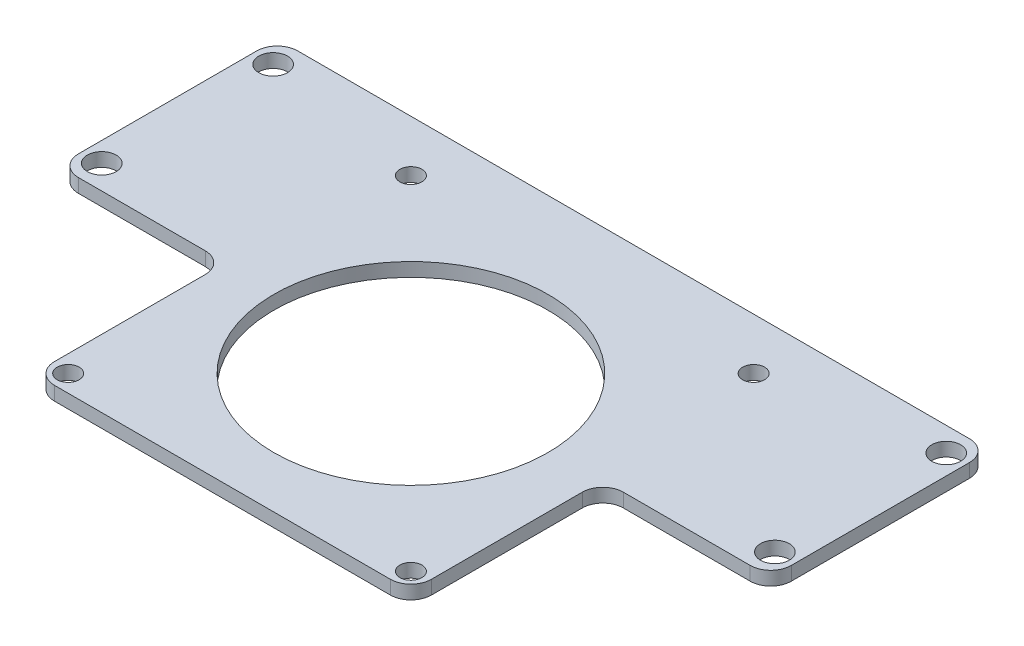
ISO-10303-21;
HEADER;
FILE_DESCRIPTION(('STEP AP214'),'2;1');
FILE_NAME('part.step','',(''),(''),'','','');
FILE_SCHEMA(('AUTOMOTIVE_DESIGN { 1 0 10303 214 1 1 1 1 }'));
ENDSEC;
DATA;
#1=APPLICATION_CONTEXT('core data for automotive mechanical design processes');
#2=APPLICATION_PROTOCOL_DEFINITION('international standard','automotive_design',2000,#1);
#3=PRODUCT_CONTEXT('',#1,'mechanical');
#4=PRODUCT('Part','Part','',(#3));
#5=PRODUCT_RELATED_PRODUCT_CATEGORY('part','',(#4));
#6=PRODUCT_DEFINITION_FORMATION('','',#4);
#7=PRODUCT_DEFINITION_CONTEXT('part definition',#1,'design');
#8=PRODUCT_DEFINITION('design','',#6,#7);
#9=PRODUCT_DEFINITION_SHAPE('','',#8);
#10=(LENGTH_UNIT() NAMED_UNIT(*) SI_UNIT(.MILLI.,.METRE.));
#11=(NAMED_UNIT(*) PLANE_ANGLE_UNIT() SI_UNIT($,.RADIAN.));
#12=(NAMED_UNIT(*) SI_UNIT($,.STERADIAN.) SOLID_ANGLE_UNIT());
#13=UNCERTAINTY_MEASURE_WITH_UNIT(LENGTH_MEASURE(1.E-05),#10,'distance_accuracy_value','');
#14=(GEOMETRIC_REPRESENTATION_CONTEXT(3) GLOBAL_UNCERTAINTY_ASSIGNED_CONTEXT((#13)) GLOBAL_UNIT_ASSIGNED_CONTEXT((#10,
#11,#12)) REPRESENTATION_CONTEXT('',''));
#15=CARTESIAN_POINT('',(0.,0.,0.));
#16=DIRECTION('',(0.,0.,1.));
#17=DIRECTION('',(1.,0.,0.));
#18=AXIS2_PLACEMENT_3D('',#15,#16,#17);
#19=CARTESIAN_POINT('',(27.5,2.,0.));
#20=DIRECTION('',(-1.,0.,0.));
#21=DIRECTION('',(0.,0.,1.));
#22=AXIS2_PLACEMENT_3D('',#19,#20,#21);
#23=PLANE('',#22);
#24=DIRECTION('',(0.,0.,-1.));
#25=VECTOR('',#24,1.);
#26=CARTESIAN_POINT('',(27.5,0.,0.));
#27=LINE('',#26,#25);
#28=CARTESIAN_POINT('',(27.5,0.,41.));
#29=VERTEX_POINT('',#28);
#30=CARTESIAN_POINT('',(27.5,0.,19.));
#31=VERTEX_POINT('',#30);
#32=EDGE_CURVE('E300',#29,#31,#27,.T.);
#33=ORIENTED_EDGE('',*,*,#32,.T.);
#34=DIRECTION('',(0.,-1.,0.));
#35=VECTOR('',#34,1.);
#36=CARTESIAN_POINT('',(27.5,2.,19.));
#37=LINE('',#36,#35);
#38=CARTESIAN_POINT('',(27.5,2.,19.));
#39=VERTEX_POINT('',#38);
#40=EDGE_CURVE('E218',#31,#39,#37,.F.);
#41=ORIENTED_EDGE('',*,*,#40,.T.);
#42=DIRECTION('',(0.,0.,-1.));
#43=VECTOR('',#42,1.);
#44=CARTESIAN_POINT('',(27.5,2.,0.));
#45=LINE('',#44,#43);
#46=CARTESIAN_POINT('',(27.5,2.,41.));
#47=VERTEX_POINT('',#46);
#48=EDGE_CURVE('E335',#47,#39,#45,.T.);
#49=ORIENTED_EDGE('',*,*,#48,.F.);
#50=DIRECTION('',(0.,-1.,0.));
#51=VECTOR('',#50,1.);
#52=CARTESIAN_POINT('',(27.5,2.,41.));
#53=LINE('',#52,#51);
#54=EDGE_CURVE('E215',#47,#29,#53,.T.);
#55=ORIENTED_EDGE('',*,*,#54,.T.);
#56=EDGE_LOOP('',(#33,#41,#49,#55));
#57=FACE_BOUND('',#56,.T.);
#58=ADVANCED_FACE('F37',(#57),#23,.F.);
#59=CARTESIAN_POINT('',(0.,2.,16.));
#60=DIRECTION('',(0.,0.,-1.));
#61=DIRECTION('',(-1.,0.,0.));
#62=AXIS2_PLACEMENT_3D('',#59,#60,#61);
#63=PLANE('',#62);
#64=DIRECTION('',(1.,0.,0.));
#65=VECTOR('',#64,1.);
#66=CARTESIAN_POINT('',(0.,0.,16.));
#67=LINE('',#66,#65);
#68=CARTESIAN_POINT('',(30.5,0.,16.));
#69=VERTEX_POINT('',#68);
#70=CARTESIAN_POINT('',(49.,0.,16.));
#71=VERTEX_POINT('',#70);
#72=EDGE_CURVE('E256',#69,#71,#67,.T.);
#73=ORIENTED_EDGE('',*,*,#72,.T.);
#74=DIRECTION('',(0.,-1.,0.));
#75=VECTOR('',#74,1.);
#76=CARTESIAN_POINT('',(49.,2.,16.));
#77=LINE('',#76,#75);
#78=CARTESIAN_POINT('',(49.,2.,16.));
#79=VERTEX_POINT('',#78);
#80=EDGE_CURVE('E213',#71,#79,#77,.F.);
#81=ORIENTED_EDGE('',*,*,#80,.T.);
#82=DIRECTION('',(1.,0.,0.));
#83=VECTOR('',#82,1.);
#84=CARTESIAN_POINT('',(0.,2.,16.));
#85=LINE('',#84,#83);
#86=CARTESIAN_POINT('',(30.5,2.,16.));
#87=VERTEX_POINT('',#86);
#88=EDGE_CURVE('E274',#87,#79,#85,.T.);
#89=ORIENTED_EDGE('',*,*,#88,.F.);
#90=DIRECTION('',(0.,-1.,0.));
#91=VECTOR('',#90,1.);
#92=CARTESIAN_POINT('',(30.5,0.,16.));
#93=LINE('',#92,#91);
#94=EDGE_CURVE('E210',#87,#69,#93,.T.);
#95=ORIENTED_EDGE('',*,*,#94,.T.);
#96=EDGE_LOOP('',(#73,#81,#89,#95));
#97=FACE_BOUND('',#96,.T.);
#98=ADVANCED_FACE('F362',(#97),#63,.F.);
#99=CARTESIAN_POINT('',(52.,2.,0.));
#100=DIRECTION('',(1.,0.,0.));
#101=DIRECTION('',(0.,0.,-1.));
#102=AXIS2_PLACEMENT_3D('',#99,#100,#101);
#103=PLANE('',#102);
#104=DIRECTION('',(0.,0.,1.));
#105=VECTOR('',#104,1.);
#106=CARTESIAN_POINT('',(52.,0.,0.));
#107=LINE('',#106,#105);
#108=CARTESIAN_POINT('',(52.,0.,-13.));
#109=VERTEX_POINT('',#108);
#110=CARTESIAN_POINT('',(52.,0.,13.));
#111=VERTEX_POINT('',#110);
#112=EDGE_CURVE('E172',#109,#111,#107,.T.);
#113=ORIENTED_EDGE('',*,*,#112,.F.);
#114=DIRECTION('',(0.,-1.,0.));
#115=VECTOR('',#114,1.);
#116=CARTESIAN_POINT('',(52.,2.,-13.));
#117=LINE('',#116,#115);
#118=CARTESIAN_POINT('',(52.,2.,-13.));
#119=VERTEX_POINT('',#118);
#120=EDGE_CURVE('E198',#109,#119,#117,.F.);
#121=ORIENTED_EDGE('',*,*,#120,.T.);
#122=DIRECTION('',(0.,0.,1.));
#123=VECTOR('',#122,1.);
#124=CARTESIAN_POINT('',(52.,2.,0.));
#125=LINE('',#124,#123);
#126=CARTESIAN_POINT('',(52.,2.,13.));
#127=VERTEX_POINT('',#126);
#128=EDGE_CURVE('E343',#119,#127,#125,.T.);
#129=ORIENTED_EDGE('',*,*,#128,.T.);
#130=DIRECTION('',(0.,-1.,0.));
#131=VECTOR('',#130,1.);
#132=CARTESIAN_POINT('',(52.,0.,13.));
#133=LINE('',#132,#131);
#134=EDGE_CURVE('E195',#127,#111,#133,.T.);
#135=ORIENTED_EDGE('',*,*,#134,.T.);
#136=EDGE_LOOP('',(#113,#121,#129,#135));
#137=FACE_BOUND('',#136,.T.);
#138=ADVANCED_FACE('F363',(#137),#103,.T.);
#139=CARTESIAN_POINT('',(0.,2.,-16.));
#140=DIRECTION('',(0.,0.,-1.));
#141=DIRECTION('',(-1.,0.,0.));
#142=AXIS2_PLACEMENT_3D('',#139,#140,#141);
#143=PLANE('',#142);
#144=DIRECTION('',(1.,0.,0.));
#145=VECTOR('',#144,1.);
#146=CARTESIAN_POINT('',(0.,2.,-16.));
#147=LINE('',#146,#145);
#148=CARTESIAN_POINT('',(-49.,2.,-16.));
#149=VERTEX_POINT('',#148);
#150=CARTESIAN_POINT('',(49.,2.,-16.));
#151=VERTEX_POINT('',#150);
#152=EDGE_CURVE('E346',#149,#151,#147,.T.);
#153=ORIENTED_EDGE('',*,*,#152,.T.);
#154=DIRECTION('',(0.,-1.,0.));
#155=VECTOR('',#154,1.);
#156=CARTESIAN_POINT('',(49.,2.,-16.));
#157=LINE('',#156,#155);
#158=CARTESIAN_POINT('',(49.,0.,-16.));
#159=VERTEX_POINT('',#158);
#160=EDGE_CURVE('E163',#151,#159,#157,.T.);
#161=ORIENTED_EDGE('',*,*,#160,.T.);
#162=DIRECTION('',(1.,0.,0.));
#163=VECTOR('',#162,1.);
#164=CARTESIAN_POINT('',(0.,0.,-16.));
#165=LINE('',#164,#163);
#166=CARTESIAN_POINT('',(-49.,0.,-16.));
#167=VERTEX_POINT('',#166);
#168=EDGE_CURVE('E155',#167,#159,#165,.T.);
#169=ORIENTED_EDGE('',*,*,#168,.F.);
#170=DIRECTION('',(0.,-1.,0.));
#171=VECTOR('',#170,1.);
#172=CARTESIAN_POINT('',(-49.,2.,-16.));
#173=LINE('',#172,#171);
#174=EDGE_CURVE('E169',#167,#149,#173,.F.);
#175=ORIENTED_EDGE('',*,*,#174,.T.);
#176=EDGE_LOOP('',(#153,#161,#169,#175));
#177=FACE_BOUND('',#176,.T.);
#178=ADVANCED_FACE('F168',(#177),#143,.T.);
#179=CARTESIAN_POINT('',(-52.,2.,0.));
#180=DIRECTION('',(1.,0.,0.));
#181=DIRECTION('',(0.,0.,-1.));
#182=AXIS2_PLACEMENT_3D('',#179,#180,#181);
#183=PLANE('',#182);
#184=DIRECTION('',(0.,0.,1.));
#185=VECTOR('',#184,1.);
#186=CARTESIAN_POINT('',(-52.,0.,0.));
#187=LINE('',#186,#185);
#188=CARTESIAN_POINT('',(-52.,0.,-13.));
#189=VERTEX_POINT('',#188);
#190=CARTESIAN_POINT('',(-52.,0.,13.));
#191=VERTEX_POINT('',#190);
#192=EDGE_CURVE('E157',#189,#191,#187,.T.);
#193=ORIENTED_EDGE('',*,*,#192,.T.);
#194=DIRECTION('',(0.,-1.,0.));
#195=VECTOR('',#194,1.);
#196=CARTESIAN_POINT('',(-52.,2.,13.));
#197=LINE('',#196,#195);
#198=CARTESIAN_POINT('',(-52.,2.,13.));
#199=VERTEX_POINT('',#198);
#200=EDGE_CURVE('E236',#191,#199,#197,.F.);
#201=ORIENTED_EDGE('',*,*,#200,.T.);
#202=DIRECTION('',(0.,0.,1.));
#203=VECTOR('',#202,1.);
#204=CARTESIAN_POINT('',(-52.,2.,0.));
#205=LINE('',#204,#203);
#206=CARTESIAN_POINT('',(-52.,2.,-13.));
#207=VERTEX_POINT('',#206);
#208=EDGE_CURVE('E272',#207,#199,#205,.T.);
#209=ORIENTED_EDGE('',*,*,#208,.F.);
#210=DIRECTION('',(0.,-1.,0.));
#211=VECTOR('',#210,1.);
#212=CARTESIAN_POINT('',(-52.,0.,-13.));
#213=LINE('',#212,#211);
#214=EDGE_CURVE('E234',#207,#189,#213,.T.);
#215=ORIENTED_EDGE('',*,*,#214,.T.);
#216=EDGE_LOOP('',(#193,#201,#209,#215));
#217=FACE_BOUND('',#216,.T.);
#218=ADVANCED_FACE('F354',(#217),#183,.F.);
#219=CARTESIAN_POINT('',(-49.,0.,16.));
#220=VERTEX_POINT('',#219);
#221=CARTESIAN_POINT('',(-30.5,0.,16.));
#222=VERTEX_POINT('',#221);
#223=EDGE_CURVE('E244',#220,#222,#67,.T.);
#224=ORIENTED_EDGE('',*,*,#223,.T.);
#225=DIRECTION('',(0.,-1.,0.));
#226=VECTOR('',#225,1.);
#227=CARTESIAN_POINT('',(-30.5,2.,16.));
#228=LINE('',#227,#226);
#229=CARTESIAN_POINT('',(-30.5,2.,16.));
#230=VERTEX_POINT('',#229);
#231=EDGE_CURVE('E232',#222,#230,#228,.F.);
#232=ORIENTED_EDGE('',*,*,#231,.T.);
#233=CARTESIAN_POINT('',(-49.,2.,16.));
#234=VERTEX_POINT('',#233);
#235=EDGE_CURVE('E264',#234,#230,#85,.T.);
#236=ORIENTED_EDGE('',*,*,#235,.F.);
#237=DIRECTION('',(0.,-1.,0.));
#238=VECTOR('',#237,1.);
#239=CARTESIAN_POINT('',(-49.,2.,16.));
#240=LINE('',#239,#238);
#241=EDGE_CURVE('E229',#234,#220,#240,.T.);
#242=ORIENTED_EDGE('',*,*,#241,.T.);
#243=EDGE_LOOP('',(#224,#232,#236,#242));
#244=FACE_BOUND('',#243,.T.);
#245=ADVANCED_FACE('F251',(#244),#63,.F.);
#246=CARTESIAN_POINT('',(-27.5,2.,0.));
#247=DIRECTION('',(-1.,0.,0.));
#248=DIRECTION('',(0.,0.,1.));
#249=AXIS2_PLACEMENT_3D('',#246,#247,#248);
#250=PLANE('',#249);
#251=DIRECTION('',(0.,0.,-1.));
#252=VECTOR('',#251,1.);
#253=CARTESIAN_POINT('',(-27.5,0.,0.));
#254=LINE('',#253,#252);
#255=CARTESIAN_POINT('',(-27.5,0.,41.));
#256=VERTEX_POINT('',#255);
#257=CARTESIAN_POINT('',(-27.5,0.,19.));
#258=VERTEX_POINT('',#257);
#259=EDGE_CURVE('E246',#256,#258,#254,.T.);
#260=ORIENTED_EDGE('',*,*,#259,.F.);
#261=DIRECTION('',(0.,-1.,0.));
#262=VECTOR('',#261,1.);
#263=CARTESIAN_POINT('',(-27.5,2.,41.));
#264=LINE('',#263,#262);
#265=CARTESIAN_POINT('',(-27.5,2.,41.));
#266=VERTEX_POINT('',#265);
#267=EDGE_CURVE('E227',#256,#266,#264,.F.);
#268=ORIENTED_EDGE('',*,*,#267,.T.);
#269=DIRECTION('',(0.,0.,-1.));
#270=VECTOR('',#269,1.);
#271=CARTESIAN_POINT('',(-27.5,2.,0.));
#272=LINE('',#271,#270);
#273=CARTESIAN_POINT('',(-27.5,2.,19.));
#274=VERTEX_POINT('',#273);
#275=EDGE_CURVE('E263',#266,#274,#272,.T.);
#276=ORIENTED_EDGE('',*,*,#275,.T.);
#277=DIRECTION('',(0.,-1.,0.));
#278=VECTOR('',#277,1.);
#279=CARTESIAN_POINT('',(-27.5,2.,19.));
#280=LINE('',#279,#278);
#281=EDGE_CURVE('E224',#274,#258,#280,.T.);
#282=ORIENTED_EDGE('',*,*,#281,.T.);
#283=EDGE_LOOP('',(#260,#268,#276,#282));
#284=FACE_BOUND('',#283,.T.);
#285=ADVANCED_FACE('F266',(#284),#250,.T.);
#286=CARTESIAN_POINT('',(25.,2.,41.5));
#287=DIRECTION('',(0.,-1.,0.));
#288=DIRECTION('',(0.,0.,-1.));
#289=AXIS2_PLACEMENT_3D('',#286,#287,#288);
#290=CYLINDRICAL_SURFACE('',#289,1.6);
#291=CARTESIAN_POINT('',(25.,2.,41.5));
#292=DIRECTION('',(0.,1.,0.));
#293=DIRECTION('',(0.,0.,1.));
#294=AXIS2_PLACEMENT_3D('',#291,#292,#293);
#295=CIRCLE('',#294,1.6);
#296=CARTESIAN_POINT('',(25.,2.,43.1));
#297=VERTEX_POINT('',#296);
#298=EDGE_CURVE('E180',#297,#297,#295,.F.);
#299=ORIENTED_EDGE('',*,*,#298,.F.);
#300=EDGE_LOOP('',(#299));
#301=FACE_BOUND('',#300,.T.);
#302=CARTESIAN_POINT('',(25.,0.,41.5));
#303=DIRECTION('',(0.,1.,0.));
#304=DIRECTION('',(0.,0.,1.));
#305=AXIS2_PLACEMENT_3D('',#302,#303,#304);
#306=CIRCLE('',#305,1.6);
#307=CARTESIAN_POINT('',(25.,0.,43.1));
#308=VERTEX_POINT('',#307);
#309=EDGE_CURVE('E330',#308,#308,#306,.F.);
#310=ORIENTED_EDGE('',*,*,#309,.T.);
#311=EDGE_LOOP('',(#310));
#312=FACE_BOUND('',#311,.T.);
#313=ADVANCED_FACE('F483',(#301,#312),#290,.F.);
#314=CARTESIAN_POINT('',(49.1,2.,-12.5));
#315=DIRECTION('',(0.,-1.,0.));
#316=DIRECTION('',(0.,0.,-1.));
#317=AXIS2_PLACEMENT_3D('',#314,#315,#316);
#318=CYLINDRICAL_SURFACE('',#317,2.1);
#319=CARTESIAN_POINT('',(49.1,2.,-12.5));
#320=DIRECTION('',(0.,1.,0.));
#321=DIRECTION('',(0.,0.,1.));
#322=AXIS2_PLACEMENT_3D('',#319,#320,#321);
#323=CIRCLE('',#322,2.1);
#324=CARTESIAN_POINT('',(49.1,2.,-10.4));
#325=VERTEX_POINT('',#324);
#326=EDGE_CURVE('E295',#325,#325,#323,.F.);
#327=ORIENTED_EDGE('',*,*,#326,.F.);
#328=EDGE_LOOP('',(#327));
#329=FACE_BOUND('',#328,.T.);
#330=CARTESIAN_POINT('',(49.1,0.,-12.5));
#331=DIRECTION('',(0.,1.,0.));
#332=DIRECTION('',(0.,0.,1.));
#333=AXIS2_PLACEMENT_3D('',#330,#331,#332);
#334=CIRCLE('',#333,2.1);
#335=CARTESIAN_POINT('',(49.1,0.,-10.4));
#336=VERTEX_POINT('',#335);
#337=EDGE_CURVE('E328',#336,#336,#334,.F.);
#338=ORIENTED_EDGE('',*,*,#337,.T.);
#339=EDGE_LOOP('',(#338));
#340=FACE_BOUND('',#339,.T.);
#341=ADVANCED_FACE('F583',(#329,#340),#318,.F.);
#342=CARTESIAN_POINT('',(49.1,2.,12.5));
#343=DIRECTION('',(0.,-1.,0.));
#344=DIRECTION('',(0.,0.,-1.));
#345=AXIS2_PLACEMENT_3D('',#342,#343,#344);
#346=CYLINDRICAL_SURFACE('',#345,2.1);
#347=CARTESIAN_POINT('',(49.1,2.,12.5));
#348=DIRECTION('',(0.,1.,0.));
#349=DIRECTION('',(0.,0.,1.));
#350=AXIS2_PLACEMENT_3D('',#347,#348,#349);
#351=CIRCLE('',#350,2.1);
#352=CARTESIAN_POINT('',(49.1,2.,14.6));
#353=VERTEX_POINT('',#352);
#354=EDGE_CURVE('E292',#353,#353,#351,.F.);
#355=ORIENTED_EDGE('',*,*,#354,.F.);
#356=EDGE_LOOP('',(#355));
#357=FACE_BOUND('',#356,.T.);
#358=CARTESIAN_POINT('',(49.1,0.,12.5));
#359=DIRECTION('',(0.,1.,0.));
#360=DIRECTION('',(0.,0.,1.));
#361=AXIS2_PLACEMENT_3D('',#358,#359,#360);
#362=CIRCLE('',#361,2.1);
#363=CARTESIAN_POINT('',(49.1,0.,14.6));
#364=VERTEX_POINT('',#363);
#365=EDGE_CURVE('E325',#364,#364,#362,.F.);
#366=ORIENTED_EDGE('',*,*,#365,.T.);
#367=EDGE_LOOP('',(#366));
#368=FACE_BOUND('',#367,.T.);
#369=ADVANCED_FACE('F573',(#357,#368),#346,.F.);
#370=CARTESIAN_POINT('',(-25.,2.,-8.5));
#371=DIRECTION('',(0.,-1.,0.));
#372=DIRECTION('',(0.,0.,-1.));
#373=AXIS2_PLACEMENT_3D('',#370,#371,#372);
#374=CYLINDRICAL_SURFACE('',#373,1.6);
#375=CARTESIAN_POINT('',(-25.,2.,-8.5));
#376=DIRECTION('',(0.,1.,0.));
#377=DIRECTION('',(0.,0.,1.));
#378=AXIS2_PLACEMENT_3D('',#375,#376,#377);
#379=CIRCLE('',#378,1.6);
#380=CARTESIAN_POINT('',(-25.,2.,-6.9));
#381=VERTEX_POINT('',#380);
#382=EDGE_CURVE('E289',#381,#381,#379,.T.);
#383=ORIENTED_EDGE('',*,*,#382,.T.);
#384=EDGE_LOOP('',(#383));
#385=FACE_BOUND('',#384,.T.);
#386=CARTESIAN_POINT('',(-25.,0.,-8.5));
#387=DIRECTION('',(0.,1.,0.));
#388=DIRECTION('',(0.,0.,1.));
#389=AXIS2_PLACEMENT_3D('',#386,#387,#388);
#390=CIRCLE('',#389,1.6);
#391=CARTESIAN_POINT('',(-25.,0.,-6.9));
#392=VERTEX_POINT('',#391);
#393=EDGE_CURVE('E322',#392,#392,#390,.T.);
#394=ORIENTED_EDGE('',*,*,#393,.F.);
#395=EDGE_LOOP('',(#394));
#396=FACE_BOUND('',#395,.T.);
#397=ADVANCED_FACE('F563',(#385,#396),#374,.F.);
#398=CARTESIAN_POINT('',(-49.1,2.,12.5));
#399=DIRECTION('',(0.,-1.,0.));
#400=DIRECTION('',(0.,0.,-1.));
#401=AXIS2_PLACEMENT_3D('',#398,#399,#400);
#402=CYLINDRICAL_SURFACE('',#401,2.1);
#403=CARTESIAN_POINT('',(-49.1,2.,12.5));
#404=DIRECTION('',(0.,1.,0.));
#405=DIRECTION('',(0.,0.,1.));
#406=AXIS2_PLACEMENT_3D('',#403,#404,#405);
#407=CIRCLE('',#406,2.1);
#408=CARTESIAN_POINT('',(-49.1,2.,14.6));
#409=VERTEX_POINT('',#408);
#410=EDGE_CURVE('E286',#409,#409,#407,.T.);
#411=ORIENTED_EDGE('',*,*,#410,.T.);
#412=EDGE_LOOP('',(#411));
#413=FACE_BOUND('',#412,.T.);
#414=CARTESIAN_POINT('',(-49.1,0.,12.5));
#415=DIRECTION('',(0.,1.,0.));
#416=DIRECTION('',(0.,0.,1.));
#417=AXIS2_PLACEMENT_3D('',#414,#415,#416);
#418=CIRCLE('',#417,2.1);
#419=CARTESIAN_POINT('',(-49.1,0.,14.6));
#420=VERTEX_POINT('',#419);
#421=EDGE_CURVE('E319',#420,#420,#418,.T.);
#422=ORIENTED_EDGE('',*,*,#421,.F.);
#423=EDGE_LOOP('',(#422));
#424=FACE_BOUND('',#423,.T.);
#425=ADVANCED_FACE('F553',(#413,#424),#402,.F.);
#426=CARTESIAN_POINT('',(-49.1,2.,-12.5));
#427=DIRECTION('',(0.,-1.,0.));
#428=DIRECTION('',(0.,0.,-1.));
#429=AXIS2_PLACEMENT_3D('',#426,#427,#428);
#430=CYLINDRICAL_SURFACE('',#429,2.1);
#431=CARTESIAN_POINT('',(-49.1,2.,-12.5));
#432=DIRECTION('',(0.,1.,0.));
#433=DIRECTION('',(0.,0.,1.));
#434=AXIS2_PLACEMENT_3D('',#431,#432,#433);
#435=CIRCLE('',#434,2.1);
#436=CARTESIAN_POINT('',(-49.1,2.,-10.4));
#437=VERTEX_POINT('',#436);
#438=EDGE_CURVE('E283',#437,#437,#435,.T.);
#439=ORIENTED_EDGE('',*,*,#438,.T.);
#440=EDGE_LOOP('',(#439));
#441=FACE_BOUND('',#440,.T.);
#442=CARTESIAN_POINT('',(-49.1,0.,-12.5));
#443=DIRECTION('',(0.,1.,0.));
#444=DIRECTION('',(0.,0.,1.));
#445=AXIS2_PLACEMENT_3D('',#442,#443,#444);
#446=CIRCLE('',#445,2.1);
#447=CARTESIAN_POINT('',(-49.1,0.,-10.4));
#448=VERTEX_POINT('',#447);
#449=EDGE_CURVE('E316',#448,#448,#446,.T.);
#450=ORIENTED_EDGE('',*,*,#449,.F.);
#451=EDGE_LOOP('',(#450));
#452=FACE_BOUND('',#451,.T.);
#453=ADVANCED_FACE('F543',(#441,#452),#430,.F.);
#454=CARTESIAN_POINT('',(25.,2.,-8.5));
#455=DIRECTION('',(0.,-1.,0.));
#456=DIRECTION('',(0.,0.,-1.));
#457=AXIS2_PLACEMENT_3D('',#454,#455,#456);
#458=CYLINDRICAL_SURFACE('',#457,1.60000000000001);
#459=CARTESIAN_POINT('',(25.,2.,-8.5));
#460=DIRECTION('',(0.,1.,0.));
#461=DIRECTION('',(0.,0.,1.));
#462=AXIS2_PLACEMENT_3D('',#459,#460,#461);
#463=CIRCLE('',#462,1.60000000000001);
#464=CARTESIAN_POINT('',(25.,2.,-6.89999999999999));
#465=VERTEX_POINT('',#464);
#466=EDGE_CURVE('E280',#465,#465,#463,.F.);
#467=ORIENTED_EDGE('',*,*,#466,.F.);
#468=EDGE_LOOP('',(#467));
#469=FACE_BOUND('',#468,.T.);
#470=CARTESIAN_POINT('',(25.,0.,-8.5));
#471=DIRECTION('',(0.,1.,0.));
#472=DIRECTION('',(0.,0.,1.));
#473=AXIS2_PLACEMENT_3D('',#470,#471,#472);
#474=CIRCLE('',#473,1.60000000000001);
#475=CARTESIAN_POINT('',(25.,0.,-6.89999999999999));
#476=VERTEX_POINT('',#475);
#477=EDGE_CURVE('E313',#476,#476,#474,.F.);
#478=ORIENTED_EDGE('',*,*,#477,.T.);
#479=EDGE_LOOP('',(#478));
#480=FACE_BOUND('',#479,.T.);
#481=ADVANCED_FACE('F533',(#469,#480),#458,.F.);
#482=CARTESIAN_POINT('',(0.,2.,16.5));
#483=DIRECTION('',(0.,-1.,0.));
#484=DIRECTION('',(0.,0.,-1.));
#485=AXIS2_PLACEMENT_3D('',#482,#483,#484);
#486=CYLINDRICAL_SURFACE('',#485,20.);
#487=CARTESIAN_POINT('',(0.,2.,16.5));
#488=DIRECTION('',(0.,1.,0.));
#489=DIRECTION('',(0.,0.,1.));
#490=AXIS2_PLACEMENT_3D('',#487,#488,#489);
#491=CIRCLE('',#490,20.);
#492=CARTESIAN_POINT('',(0.,2.,36.5));
#493=VERTEX_POINT('',#492);
#494=EDGE_CURVE('E270',#493,#493,#491,.T.);
#495=ORIENTED_EDGE('',*,*,#494,.T.);
#496=EDGE_LOOP('',(#495));
#497=FACE_BOUND('',#496,.T.);
#498=CARTESIAN_POINT('',(0.,0.,16.5));
#499=DIRECTION('',(0.,1.,0.));
#500=DIRECTION('',(0.,0.,1.));
#501=AXIS2_PLACEMENT_3D('',#498,#499,#500);
#502=CIRCLE('',#501,20.);
#503=CARTESIAN_POINT('',(0.,0.,36.5));
#504=VERTEX_POINT('',#503);
#505=EDGE_CURVE('E310',#504,#504,#502,.T.);
#506=ORIENTED_EDGE('',*,*,#505,.F.);
#507=EDGE_LOOP('',(#506));
#508=FACE_BOUND('',#507,.T.);
#509=ADVANCED_FACE('F471',(#497,#508),#486,.F.);
#510=CARTESIAN_POINT('',(0.,2.,44.));
#511=DIRECTION('',(0.,0.,-1.));
#512=DIRECTION('',(-1.,0.,0.));
#513=AXIS2_PLACEMENT_3D('',#510,#511,#512);
#514=PLANE('',#513);
#515=DIRECTION('',(1.,0.,0.));
#516=VECTOR('',#515,1.);
#517=CARTESIAN_POINT('',(0.,0.,44.));
#518=LINE('',#517,#516);
#519=CARTESIAN_POINT('',(-24.5,0.,44.));
#520=VERTEX_POINT('',#519);
#521=CARTESIAN_POINT('',(24.5,0.,44.));
#522=VERTEX_POINT('',#521);
#523=EDGE_CURVE('E308',#520,#522,#518,.T.);
#524=ORIENTED_EDGE('',*,*,#523,.T.);
#525=DIRECTION('',(0.,-1.,0.));
#526=VECTOR('',#525,1.);
#527=CARTESIAN_POINT('',(24.5,2.,44.));
#528=LINE('',#527,#526);
#529=CARTESIAN_POINT('',(24.5,2.,44.));
#530=VERTEX_POINT('',#529);
#531=EDGE_CURVE('E52',#522,#530,#528,.F.);
#532=ORIENTED_EDGE('',*,*,#531,.T.);
#533=DIRECTION('',(1.,0.,0.));
#534=VECTOR('',#533,1.);
#535=CARTESIAN_POINT('',(0.,2.,44.));
#536=LINE('',#535,#534);
#537=CARTESIAN_POINT('',(-24.5,2.,44.));
#538=VERTEX_POINT('',#537);
#539=EDGE_CURVE('E268',#538,#530,#536,.T.);
#540=ORIENTED_EDGE('',*,*,#539,.F.);
#541=DIRECTION('',(0.,-1.,0.));
#542=VECTOR('',#541,1.);
#543=CARTESIAN_POINT('',(-24.5,0.,44.));
#544=LINE('',#543,#542);
#545=EDGE_CURVE('E220',#538,#520,#544,.T.);
#546=ORIENTED_EDGE('',*,*,#545,.T.);
#547=EDGE_LOOP('',(#524,#532,#540,#546));
#548=FACE_BOUND('',#547,.T.);
#549=ADVANCED_FACE('F466',(#548),#514,.F.);
#550=CARTESIAN_POINT('',(-25.,2.,41.5));
#551=DIRECTION('',(0.,-1.,0.));
#552=DIRECTION('',(0.,0.,-1.));
#553=AXIS2_PLACEMENT_3D('',#550,#551,#552);
#554=CYLINDRICAL_SURFACE('',#553,1.6);
#555=CARTESIAN_POINT('',(-25.,2.,41.5));
#556=DIRECTION('',(0.,1.,0.));
#557=DIRECTION('',(0.,0.,1.));
#558=AXIS2_PLACEMENT_3D('',#555,#556,#557);
#559=CIRCLE('',#558,1.6);
#560=CARTESIAN_POINT('',(-25.,2.,43.1));
#561=VERTEX_POINT('',#560);
#562=EDGE_CURVE('E176',#561,#561,#559,.T.);
#563=ORIENTED_EDGE('',*,*,#562,.T.);
#564=EDGE_LOOP('',(#563));
#565=FACE_BOUND('',#564,.T.);
#566=CARTESIAN_POINT('',(-25.,0.,41.5));
#567=DIRECTION('',(0.,1.,0.));
#568=DIRECTION('',(0.,0.,1.));
#569=AXIS2_PLACEMENT_3D('',#566,#567,#568);
#570=CIRCLE('',#569,1.6);
#571=CARTESIAN_POINT('',(-25.,0.,43.1));
#572=VERTEX_POINT('',#571);
#573=EDGE_CURVE('E183',#572,#572,#570,.T.);
#574=ORIENTED_EDGE('',*,*,#573,.F.);
#575=EDGE_LOOP('',(#574));
#576=FACE_BOUND('',#575,.T.);
#577=ADVANCED_FACE('F459',(#565,#576),#554,.F.);
#578=CARTESIAN_POINT('',(0.,2.,0.));
#579=DIRECTION('',(0.,1.,0.));
#580=DIRECTION('',(0.,0.,1.));
#581=AXIS2_PLACEMENT_3D('',#578,#579,#580);
#582=PLANE('',#581);
#583=ORIENTED_EDGE('',*,*,#128,.F.);
#584=CARTESIAN_POINT('',(49.,2.,-13.));
#585=DIRECTION('',(0.,1.,0.));
#586=DIRECTION('',(0.,0.,1.));
#587=AXIS2_PLACEMENT_3D('',#584,#585,#586);
#588=CIRCLE('',#587,3.);
#589=EDGE_CURVE('E208',#119,#151,#588,.T.);
#590=ORIENTED_EDGE('',*,*,#589,.T.);
#591=ORIENTED_EDGE('',*,*,#152,.F.);
#592=CARTESIAN_POINT('',(-49.,2.,-13.));
#593=DIRECTION('',(0.,1.,0.));
#594=DIRECTION('',(0.,0.,1.));
#595=AXIS2_PLACEMENT_3D('',#592,#593,#594);
#596=CIRCLE('',#595,3.);
#597=EDGE_CURVE('E175',#149,#207,#596,.T.);
#598=ORIENTED_EDGE('',*,*,#597,.T.);
#599=ORIENTED_EDGE('',*,*,#208,.T.);
#600=CARTESIAN_POINT('',(-49.,2.,13.));
#601=DIRECTION('',(0.,1.,0.));
#602=DIRECTION('',(0.,0.,1.));
#603=AXIS2_PLACEMENT_3D('',#600,#601,#602);
#604=CIRCLE('',#603,3.);
#605=EDGE_CURVE('E201',#199,#234,#604,.T.);
#606=ORIENTED_EDGE('',*,*,#605,.T.);
#607=ORIENTED_EDGE('',*,*,#235,.T.);
#608=CARTESIAN_POINT('',(-30.5,2.,19.));
#609=DIRECTION('',(0.,1.,0.));
#610=DIRECTION('',(0.,0.,1.));
#611=AXIS2_PLACEMENT_3D('',#608,#609,#610);
#612=CIRCLE('',#611,3.);
#613=EDGE_CURVE('E11',#230,#274,#612,.F.);
#614=ORIENTED_EDGE('',*,*,#613,.T.);
#615=ORIENTED_EDGE('',*,*,#275,.F.);
#616=CARTESIAN_POINT('',(-24.5,2.,41.));
#617=DIRECTION('',(0.,1.,0.));
#618=DIRECTION('',(0.,0.,1.));
#619=AXIS2_PLACEMENT_3D('',#616,#617,#618);
#620=CIRCLE('',#619,3.);
#621=EDGE_CURVE('E59',#266,#538,#620,.T.);
#622=ORIENTED_EDGE('',*,*,#621,.T.);
#623=ORIENTED_EDGE('',*,*,#539,.T.);
#624=CARTESIAN_POINT('',(24.5,2.,41.));
#625=DIRECTION('',(0.,1.,0.));
#626=DIRECTION('',(0.,0.,1.));
#627=AXIS2_PLACEMENT_3D('',#624,#625,#626);
#628=CIRCLE('',#627,3.);
#629=EDGE_CURVE('E204',#530,#47,#628,.T.);
#630=ORIENTED_EDGE('',*,*,#629,.T.);
#631=ORIENTED_EDGE('',*,*,#48,.T.);
#632=CARTESIAN_POINT('',(30.5,2.,19.));
#633=DIRECTION('',(0.,1.,0.));
#634=DIRECTION('',(0.,0.,1.));
#635=AXIS2_PLACEMENT_3D('',#632,#633,#634);
#636=CIRCLE('',#635,3.);
#637=EDGE_CURVE('E240',#39,#87,#636,.F.);
#638=ORIENTED_EDGE('',*,*,#637,.T.);
#639=ORIENTED_EDGE('',*,*,#88,.T.);
#640=CARTESIAN_POINT('',(49.,2.,13.));
#641=DIRECTION('',(0.,1.,0.));
#642=DIRECTION('',(0.,0.,1.));
#643=AXIS2_PLACEMENT_3D('',#640,#641,#642);
#644=CIRCLE('',#643,3.);
#645=EDGE_CURVE('E206',#79,#127,#644,.T.);
#646=ORIENTED_EDGE('',*,*,#645,.T.);
#647=EDGE_LOOP('',(#583,#590,#591,#598,#599,#606,#607,#614,#615,#622,#623,#630,#631,#638,#639,#646));
#648=FACE_BOUND('',#647,.T.);
#649=ORIENTED_EDGE('',*,*,#494,.F.);
#650=EDGE_LOOP('',(#649));
#651=FACE_BOUND('',#650,.T.);
#652=ORIENTED_EDGE('',*,*,#466,.T.);
#653=EDGE_LOOP('',(#652));
#654=FACE_BOUND('',#653,.T.);
#655=ORIENTED_EDGE('',*,*,#438,.F.);
#656=EDGE_LOOP('',(#655));
#657=FACE_BOUND('',#656,.T.);
#658=ORIENTED_EDGE('',*,*,#410,.F.);
#659=EDGE_LOOP('',(#658));
#660=FACE_BOUND('',#659,.T.);
#661=ORIENTED_EDGE('',*,*,#382,.F.);
#662=EDGE_LOOP('',(#661));
#663=FACE_BOUND('',#662,.T.);
#664=ORIENTED_EDGE('',*,*,#354,.T.);
#665=EDGE_LOOP('',(#664));
#666=FACE_BOUND('',#665,.T.);
#667=ORIENTED_EDGE('',*,*,#326,.T.);
#668=EDGE_LOOP('',(#667));
#669=FACE_BOUND('',#668,.T.);
#670=ORIENTED_EDGE('',*,*,#298,.T.);
#671=EDGE_LOOP('',(#670));
#672=FACE_BOUND('',#671,.T.);
#673=ORIENTED_EDGE('',*,*,#562,.F.);
#674=EDGE_LOOP('',(#673));
#675=FACE_BOUND('',#674,.T.);
#676=ADVANCED_FACE('F261',(#648,#651,#654,#657,#660,#663,#666,#669,#672,#675),#582,.T.);
#677=CARTESIAN_POINT('',(0.,0.,0.));
#678=DIRECTION('',(0.,1.,0.));
#679=DIRECTION('',(0.,0.,1.));
#680=AXIS2_PLACEMENT_3D('',#677,#678,#679);
#681=PLANE('',#680);
#682=ORIENTED_EDGE('',*,*,#168,.T.);
#683=CARTESIAN_POINT('',(49.,0.,-13.));
#684=DIRECTION('',(0.,1.,0.));
#685=DIRECTION('',(0.,0.,1.));
#686=AXIS2_PLACEMENT_3D('',#683,#684,#685);
#687=CIRCLE('',#686,3.);
#688=EDGE_CURVE('E193',#159,#109,#687,.F.);
#689=ORIENTED_EDGE('',*,*,#688,.T.);
#690=ORIENTED_EDGE('',*,*,#112,.T.);
#691=CARTESIAN_POINT('',(49.,0.,13.));
#692=DIRECTION('',(0.,1.,0.));
#693=DIRECTION('',(0.,0.,1.));
#694=AXIS2_PLACEMENT_3D('',#691,#692,#693);
#695=CIRCLE('',#694,3.);
#696=EDGE_CURVE('E191',#111,#71,#695,.F.);
#697=ORIENTED_EDGE('',*,*,#696,.T.);
#698=ORIENTED_EDGE('',*,*,#72,.F.);
#699=CARTESIAN_POINT('',(30.5,0.,19.));
#700=DIRECTION('',(0.,1.,0.));
#701=DIRECTION('',(0.,0.,1.));
#702=AXIS2_PLACEMENT_3D('',#699,#700,#701);
#703=CIRCLE('',#702,3.);
#704=EDGE_CURVE('E238',#69,#31,#703,.T.);
#705=ORIENTED_EDGE('',*,*,#704,.T.);
#706=ORIENTED_EDGE('',*,*,#32,.F.);
#707=CARTESIAN_POINT('',(24.5,0.,41.));
#708=DIRECTION('',(0.,1.,0.));
#709=DIRECTION('',(0.,0.,1.));
#710=AXIS2_PLACEMENT_3D('',#707,#708,#709);
#711=CIRCLE('',#710,3.);
#712=EDGE_CURVE('E189',#29,#522,#711,.F.);
#713=ORIENTED_EDGE('',*,*,#712,.T.);
#714=ORIENTED_EDGE('',*,*,#523,.F.);
#715=CARTESIAN_POINT('',(-24.5,0.,41.));
#716=DIRECTION('',(0.,1.,0.));
#717=DIRECTION('',(0.,0.,1.));
#718=AXIS2_PLACEMENT_3D('',#715,#716,#717);
#719=CIRCLE('',#718,3.);
#720=EDGE_CURVE('E187',#520,#256,#719,.F.);
#721=ORIENTED_EDGE('',*,*,#720,.T.);
#722=ORIENTED_EDGE('',*,*,#259,.T.);
#723=CARTESIAN_POINT('',(-30.5,0.,19.));
#724=DIRECTION('',(0.,1.,0.));
#725=DIRECTION('',(0.,0.,1.));
#726=AXIS2_PLACEMENT_3D('',#723,#724,#725);
#727=CIRCLE('',#726,3.);
#728=EDGE_CURVE('E45',#258,#222,#727,.T.);
#729=ORIENTED_EDGE('',*,*,#728,.T.);
#730=ORIENTED_EDGE('',*,*,#223,.F.);
#731=CARTESIAN_POINT('',(-49.,0.,13.));
#732=DIRECTION('',(0.,1.,0.));
#733=DIRECTION('',(0.,0.,1.));
#734=AXIS2_PLACEMENT_3D('',#731,#732,#733);
#735=CIRCLE('',#734,3.);
#736=EDGE_CURVE('E162',#220,#191,#735,.F.);
#737=ORIENTED_EDGE('',*,*,#736,.T.);
#738=ORIENTED_EDGE('',*,*,#192,.F.);
#739=CARTESIAN_POINT('',(-49.,0.,-13.));
#740=DIRECTION('',(0.,1.,0.));
#741=DIRECTION('',(0.,0.,1.));
#742=AXIS2_PLACEMENT_3D('',#739,#740,#741);
#743=CIRCLE('',#742,3.);
#744=EDGE_CURVE('E151',#189,#167,#743,.F.);
#745=ORIENTED_EDGE('',*,*,#744,.T.);
#746=EDGE_LOOP('',(#682,#689,#690,#697,#698,#705,#706,#713,#714,#721,#722,#729,#730,#737,#738,#745));
#747=FACE_BOUND('',#746,.T.);
#748=ORIENTED_EDGE('',*,*,#505,.T.);
#749=EDGE_LOOP('',(#748));
#750=FACE_BOUND('',#749,.T.);
#751=ORIENTED_EDGE('',*,*,#477,.F.);
#752=EDGE_LOOP('',(#751));
#753=FACE_BOUND('',#752,.T.);
#754=ORIENTED_EDGE('',*,*,#449,.T.);
#755=EDGE_LOOP('',(#754));
#756=FACE_BOUND('',#755,.T.);
#757=ORIENTED_EDGE('',*,*,#421,.T.);
#758=EDGE_LOOP('',(#757));
#759=FACE_BOUND('',#758,.T.);
#760=ORIENTED_EDGE('',*,*,#393,.T.);
#761=EDGE_LOOP('',(#760));
#762=FACE_BOUND('',#761,.T.);
#763=ORIENTED_EDGE('',*,*,#365,.F.);
#764=EDGE_LOOP('',(#763));
#765=FACE_BOUND('',#764,.T.);
#766=ORIENTED_EDGE('',*,*,#337,.F.);
#767=EDGE_LOOP('',(#766));
#768=FACE_BOUND('',#767,.T.);
#769=ORIENTED_EDGE('',*,*,#309,.F.);
#770=EDGE_LOOP('',(#769));
#771=FACE_BOUND('',#770,.T.);
#772=ORIENTED_EDGE('',*,*,#573,.T.);
#773=EDGE_LOOP('',(#772));
#774=FACE_BOUND('',#773,.T.);
#775=ADVANCED_FACE('F153',(#747,#750,#753,#756,#759,#762,#765,#768,#771,#774),#681,.F.);
#776=CARTESIAN_POINT('',(49.,2.,-13.));
#777=DIRECTION('',(0.,-1.,0.));
#778=DIRECTION('',(0.,0.,-1.));
#779=AXIS2_PLACEMENT_3D('',#776,#777,#778);
#780=CYLINDRICAL_SURFACE('',#779,3.);
#781=ORIENTED_EDGE('',*,*,#589,.F.);
#782=ORIENTED_EDGE('',*,*,#120,.F.);
#783=ORIENTED_EDGE('',*,*,#688,.F.);
#784=ORIENTED_EDGE('',*,*,#160,.F.);
#785=EDGE_LOOP('',(#781,#782,#783,#784));
#786=FACE_BOUND('',#785,.T.);
#787=ADVANCED_FACE('F374',(#786),#780,.T.);
#788=CARTESIAN_POINT('',(49.,2.,13.));
#789=DIRECTION('',(0.,1.,0.));
#790=DIRECTION('',(0.,0.,1.));
#791=AXIS2_PLACEMENT_3D('',#788,#789,#790);
#792=CYLINDRICAL_SURFACE('',#791,3.);
#793=ORIENTED_EDGE('',*,*,#645,.F.);
#794=ORIENTED_EDGE('',*,*,#80,.F.);
#795=ORIENTED_EDGE('',*,*,#696,.F.);
#796=ORIENTED_EDGE('',*,*,#134,.F.);
#797=EDGE_LOOP('',(#793,#794,#795,#796));
#798=FACE_BOUND('',#797,.T.);
#799=ADVANCED_FACE('F377',(#798),#792,.T.);
#800=CARTESIAN_POINT('',(30.5,2.,19.));
#801=DIRECTION('',(0.,1.,0.));
#802=DIRECTION('',(0.,0.,1.));
#803=AXIS2_PLACEMENT_3D('',#800,#801,#802);
#804=CYLINDRICAL_SURFACE('',#803,3.);
#805=ORIENTED_EDGE('',*,*,#637,.F.);
#806=ORIENTED_EDGE('',*,*,#40,.F.);
#807=ORIENTED_EDGE('',*,*,#704,.F.);
#808=ORIENTED_EDGE('',*,*,#94,.F.);
#809=EDGE_LOOP('',(#805,#806,#807,#808));
#810=FACE_BOUND('',#809,.T.);
#811=ADVANCED_FACE('F381',(#810),#804,.F.);
#812=CARTESIAN_POINT('',(24.5,2.,41.));
#813=DIRECTION('',(0.,-1.,0.));
#814=DIRECTION('',(0.,0.,-1.));
#815=AXIS2_PLACEMENT_3D('',#812,#813,#814);
#816=CYLINDRICAL_SURFACE('',#815,3.);
#817=ORIENTED_EDGE('',*,*,#629,.F.);
#818=ORIENTED_EDGE('',*,*,#531,.F.);
#819=ORIENTED_EDGE('',*,*,#712,.F.);
#820=ORIENTED_EDGE('',*,*,#54,.F.);
#821=EDGE_LOOP('',(#817,#818,#819,#820));
#822=FACE_BOUND('',#821,.T.);
#823=ADVANCED_FACE('F385',(#822),#816,.T.);
#824=CARTESIAN_POINT('',(-24.5,2.,41.));
#825=DIRECTION('',(0.,1.,0.));
#826=DIRECTION('',(0.,0.,1.));
#827=AXIS2_PLACEMENT_3D('',#824,#825,#826);
#828=CYLINDRICAL_SURFACE('',#827,3.);
#829=ORIENTED_EDGE('',*,*,#621,.F.);
#830=ORIENTED_EDGE('',*,*,#267,.F.);
#831=ORIENTED_EDGE('',*,*,#720,.F.);
#832=ORIENTED_EDGE('',*,*,#545,.F.);
#833=EDGE_LOOP('',(#829,#830,#831,#832));
#834=FACE_BOUND('',#833,.T.);
#835=ADVANCED_FACE('F389',(#834),#828,.T.);
#836=CARTESIAN_POINT('',(-30.5,2.,19.));
#837=DIRECTION('',(0.,-1.,0.));
#838=DIRECTION('',(0.,0.,-1.));
#839=AXIS2_PLACEMENT_3D('',#836,#837,#838);
#840=CYLINDRICAL_SURFACE('',#839,3.);
#841=ORIENTED_EDGE('',*,*,#613,.F.);
#842=ORIENTED_EDGE('',*,*,#231,.F.);
#843=ORIENTED_EDGE('',*,*,#728,.F.);
#844=ORIENTED_EDGE('',*,*,#281,.F.);
#845=EDGE_LOOP('',(#841,#842,#843,#844));
#846=FACE_BOUND('',#845,.T.);
#847=ADVANCED_FACE('F258',(#846),#840,.F.);
#848=CARTESIAN_POINT('',(-49.,2.,13.));
#849=DIRECTION('',(0.,-1.,0.));
#850=DIRECTION('',(0.,0.,-1.));
#851=AXIS2_PLACEMENT_3D('',#848,#849,#850);
#852=CYLINDRICAL_SURFACE('',#851,3.);
#853=ORIENTED_EDGE('',*,*,#605,.F.);
#854=ORIENTED_EDGE('',*,*,#200,.F.);
#855=ORIENTED_EDGE('',*,*,#736,.F.);
#856=ORIENTED_EDGE('',*,*,#241,.F.);
#857=EDGE_LOOP('',(#853,#854,#855,#856));
#858=FACE_BOUND('',#857,.T.);
#859=ADVANCED_FACE('F353',(#858),#852,.T.);
#860=CARTESIAN_POINT('',(-49.,2.,-13.));
#861=DIRECTION('',(0.,1.,0.));
#862=DIRECTION('',(0.,0.,1.));
#863=AXIS2_PLACEMENT_3D('',#860,#861,#862);
#864=CYLINDRICAL_SURFACE('',#863,3.);
#865=ORIENTED_EDGE('',*,*,#597,.F.);
#866=ORIENTED_EDGE('',*,*,#174,.F.);
#867=ORIENTED_EDGE('',*,*,#744,.F.);
#868=ORIENTED_EDGE('',*,*,#214,.F.);
#869=EDGE_LOOP('',(#865,#866,#867,#868));
#870=FACE_BOUND('',#869,.T.);
#871=ADVANCED_FACE('F39',(#870),#864,.T.);
#872=CLOSED_SHELL('',(#58,#98,#138,#178,#218,#245,#285,#313,#341,#369,#397,#425,#453,#481,#509,
#549,#577,#676,#775,#787,#799,#811,#823,#835,#847,#859,#871));
#873=MANIFOLD_SOLID_BREP('B2',#872);
#874=ADVANCED_BREP_SHAPE_REPRESENTATION('',(#18,#873),#14);
#875=SHAPE_DEFINITION_REPRESENTATION(#9,#874);
ENDSEC;
END-ISO-10303-21;
